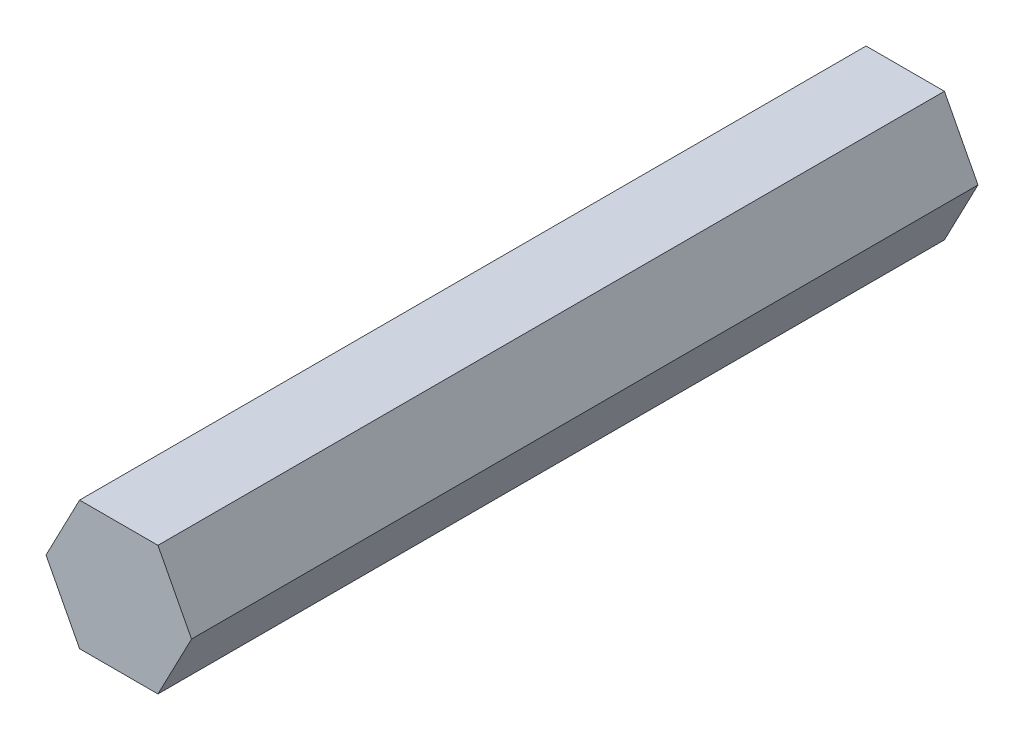
ISO-10303-21;
HEADER;
FILE_DESCRIPTION(('STEP AP214'),'2;1');
FILE_NAME('part.step','',(''),(''),'','','');
FILE_SCHEMA(('AUTOMOTIVE_DESIGN { 1 0 10303 214 1 1 1 1 }'));
ENDSEC;
DATA;
#1=APPLICATION_CONTEXT('core data for automotive mechanical design processes');
#2=APPLICATION_PROTOCOL_DEFINITION('international standard','automotive_design',2000,#1);
#3=PRODUCT_CONTEXT('',#1,'mechanical');
#4=PRODUCT('Part','Part','',(#3));
#5=PRODUCT_RELATED_PRODUCT_CATEGORY('part','',(#4));
#6=PRODUCT_DEFINITION_FORMATION('','',#4);
#7=PRODUCT_DEFINITION_CONTEXT('part definition',#1,'design');
#8=PRODUCT_DEFINITION('design','',#6,#7);
#9=PRODUCT_DEFINITION_SHAPE('','',#8);
#10=(LENGTH_UNIT() NAMED_UNIT(*) SI_UNIT(.MILLI.,.METRE.));
#11=(NAMED_UNIT(*) PLANE_ANGLE_UNIT() SI_UNIT($,.RADIAN.));
#12=(NAMED_UNIT(*) SI_UNIT($,.STERADIAN.) SOLID_ANGLE_UNIT());
#13=UNCERTAINTY_MEASURE_WITH_UNIT(LENGTH_MEASURE(1.E-05),#10,'distance_accuracy_value','');
#14=(GEOMETRIC_REPRESENTATION_CONTEXT(3) GLOBAL_UNCERTAINTY_ASSIGNED_CONTEXT((#13)) GLOBAL_UNIT_ASSIGNED_CONTEXT((#10,
#11,#12)) REPRESENTATION_CONTEXT('',''));
#15=CARTESIAN_POINT('',(0.,0.,0.));
#16=DIRECTION('',(0.,0.,1.));
#17=DIRECTION('',(1.,0.,0.));
#18=AXIS2_PLACEMENT_3D('',#15,#16,#17);
#19=CARTESIAN_POINT('',(-2.59978738302891,2.3,28.1));
#20=DIRECTION('',(0.886618456329491,-0.462501581506389,0.));
#21=DIRECTION('',(0.462501581506389,0.886618456329491,0.));
#22=AXIS2_PLACEMENT_3D('',#19,#20,#21);
#23=PLANE('',#22);
#24=DIRECTION('',(-0.462501581506389,-0.886618456329491,0.));
#25=VECTOR('',#24,1.);
#26=CARTESIAN_POINT('',(-2.59978738302891,2.3,0.));
#27=LINE('',#26,#25);
#28=CARTESIAN_POINT('',(-1.4,4.6,0.));
#29=VERTEX_POINT('',#28);
#30=CARTESIAN_POINT('',(-2.59978738302891,2.3,0.));
#31=VERTEX_POINT('',#30);
#32=EDGE_CURVE('E128',#29,#31,#27,.T.);
#33=ORIENTED_EDGE('',*,*,#32,.T.);
#34=DIRECTION('',(0.,0.,-1.));
#35=VECTOR('',#34,1.);
#36=CARTESIAN_POINT('',(-2.59978738302891,2.3,28.1));
#37=LINE('',#36,#35);
#38=CARTESIAN_POINT('',(-2.59978738302891,2.3,28.1));
#39=VERTEX_POINT('',#38);
#40=EDGE_CURVE('E11',#39,#31,#37,.T.);
#41=ORIENTED_EDGE('',*,*,#40,.F.);
#42=DIRECTION('',(-0.462501581506389,-0.886618456329491,0.));
#43=VECTOR('',#42,1.);
#44=CARTESIAN_POINT('',(-2.59978738302891,2.3,28.1));
#45=LINE('',#44,#43);
#46=CARTESIAN_POINT('',(-1.4,4.6,28.1));
#47=VERTEX_POINT('',#46);
#48=EDGE_CURVE('E145',#47,#39,#45,.T.);
#49=ORIENTED_EDGE('',*,*,#48,.F.);
#50=DIRECTION('',(0.,0.,-1.));
#51=VECTOR('',#50,1.);
#52=CARTESIAN_POINT('',(-1.4,4.6,28.1));
#53=LINE('',#52,#51);
#54=EDGE_CURVE('E124',#47,#29,#53,.T.);
#55=ORIENTED_EDGE('',*,*,#54,.T.);
#56=EDGE_LOOP('',(#33,#41,#49,#55));
#57=FACE_BOUND('',#56,.T.);
#58=ADVANCED_FACE('F39',(#57),#23,.F.);
#59=CARTESIAN_POINT('',(-1.4,0.,28.1));
#60=DIRECTION('',(0.886618456329491,0.462501581506389,0.));
#61=DIRECTION('',(-0.462501581506389,0.886618456329491,0.));
#62=AXIS2_PLACEMENT_3D('',#59,#60,#61);
#63=PLANE('',#62);
#64=DIRECTION('',(0.462501581506389,-0.886618456329491,0.));
#65=VECTOR('',#64,1.);
#66=CARTESIAN_POINT('',(-1.4,0.,0.));
#67=LINE('',#66,#65);
#68=CARTESIAN_POINT('',(-1.4,0.,0.));
#69=VERTEX_POINT('',#68);
#70=EDGE_CURVE('E132',#31,#69,#67,.T.);
#71=ORIENTED_EDGE('',*,*,#70,.T.);
#72=DIRECTION('',(0.,0.,-1.));
#73=VECTOR('',#72,1.);
#74=CARTESIAN_POINT('',(-1.4,0.,28.1));
#75=LINE('',#74,#73);
#76=CARTESIAN_POINT('',(-1.4,0.,28.1));
#77=VERTEX_POINT('',#76);
#78=EDGE_CURVE('E48',#77,#69,#75,.T.);
#79=ORIENTED_EDGE('',*,*,#78,.F.);
#80=DIRECTION('',(0.462501581506389,-0.886618456329491,0.));
#81=VECTOR('',#80,1.);
#82=CARTESIAN_POINT('',(-1.4,0.,28.1));
#83=LINE('',#82,#81);
#84=EDGE_CURVE('E93',#39,#77,#83,.T.);
#85=ORIENTED_EDGE('',*,*,#84,.F.);
#86=ORIENTED_EDGE('',*,*,#40,.T.);
#87=EDGE_LOOP('',(#71,#79,#85,#86));
#88=FACE_BOUND('',#87,.T.);
#89=ADVANCED_FACE('F173',(#88),#63,.F.);
#90=CARTESIAN_POINT('',(-1.4,0.,28.1));
#91=DIRECTION('',(0.,1.,0.));
#92=DIRECTION('',(-1.,0.,0.));
#93=AXIS2_PLACEMENT_3D('',#90,#91,#92);
#94=PLANE('',#93);
#95=DIRECTION('',(1.,0.,0.));
#96=VECTOR('',#95,1.);
#97=CARTESIAN_POINT('',(-1.4,0.,0.));
#98=LINE('',#97,#96);
#99=CARTESIAN_POINT('',(1.4,0.,0.));
#100=VERTEX_POINT('',#99);
#101=EDGE_CURVE('E136',#69,#100,#98,.T.);
#102=ORIENTED_EDGE('',*,*,#101,.T.);
#103=DIRECTION('',(0.,0.,-1.));
#104=VECTOR('',#103,1.);
#105=CARTESIAN_POINT('',(1.4,0.,28.1));
#106=LINE('',#105,#104);
#107=CARTESIAN_POINT('',(1.4,0.,28.1));
#108=VERTEX_POINT('',#107);
#109=EDGE_CURVE('E117',#108,#100,#106,.T.);
#110=ORIENTED_EDGE('',*,*,#109,.F.);
#111=DIRECTION('',(1.,0.,0.));
#112=VECTOR('',#111,1.);
#113=CARTESIAN_POINT('',(-1.4,0.,28.1));
#114=LINE('',#113,#112);
#115=EDGE_CURVE('E106',#77,#108,#114,.T.);
#116=ORIENTED_EDGE('',*,*,#115,.F.);
#117=ORIENTED_EDGE('',*,*,#78,.T.);
#118=EDGE_LOOP('',(#102,#110,#116,#117));
#119=FACE_BOUND('',#118,.T.);
#120=ADVANCED_FACE('F155',(#119),#94,.F.);
#121=CARTESIAN_POINT('',(1.4,0.,28.1));
#122=DIRECTION('',(-0.886618456329491,0.462501581506389,0.));
#123=DIRECTION('',(-0.462501581506389,-0.886618456329491,0.));
#124=AXIS2_PLACEMENT_3D('',#121,#122,#123);
#125=PLANE('',#124);
#126=DIRECTION('',(0.462501581506389,0.886618456329491,0.));
#127=VECTOR('',#126,1.);
#128=CARTESIAN_POINT('',(1.4,0.,0.));
#129=LINE('',#128,#127);
#130=CARTESIAN_POINT('',(2.59978738302891,2.3,0.));
#131=VERTEX_POINT('',#130);
#132=EDGE_CURVE('E115',#100,#131,#129,.T.);
#133=ORIENTED_EDGE('',*,*,#132,.T.);
#134=DIRECTION('',(0.,0.,-1.));
#135=VECTOR('',#134,1.);
#136=CARTESIAN_POINT('',(2.59978738302891,2.3,28.1));
#137=LINE('',#136,#135);
#138=CARTESIAN_POINT('',(2.59978738302891,2.3,28.1));
#139=VERTEX_POINT('',#138);
#140=EDGE_CURVE('E112',#139,#131,#137,.T.);
#141=ORIENTED_EDGE('',*,*,#140,.F.);
#142=DIRECTION('',(0.462501581506389,0.886618456329491,0.));
#143=VECTOR('',#142,1.);
#144=CARTESIAN_POINT('',(1.4,0.,28.1));
#145=LINE('',#144,#143);
#146=EDGE_CURVE('E100',#108,#139,#145,.T.);
#147=ORIENTED_EDGE('',*,*,#146,.F.);
#148=ORIENTED_EDGE('',*,*,#109,.T.);
#149=EDGE_LOOP('',(#133,#141,#147,#148));
#150=FACE_BOUND('',#149,.T.);
#151=ADVANCED_FACE('F113',(#150),#125,.F.);
#152=CARTESIAN_POINT('',(2.59978738302891,2.3,28.1));
#153=DIRECTION('',(-0.886618456329491,-0.462501581506389,0.));
#154=DIRECTION('',(0.462501581506389,-0.886618456329491,0.));
#155=AXIS2_PLACEMENT_3D('',#152,#153,#154);
#156=PLANE('',#155);
#157=DIRECTION('',(-0.462501581506389,0.886618456329491,0.));
#158=VECTOR('',#157,1.);
#159=CARTESIAN_POINT('',(2.59978738302891,2.3,0.));
#160=LINE('',#159,#158);
#161=CARTESIAN_POINT('',(1.4,4.6,0.));
#162=VERTEX_POINT('',#161);
#163=EDGE_CURVE('E79',#131,#162,#160,.T.);
#164=ORIENTED_EDGE('',*,*,#163,.T.);
#165=DIRECTION('',(0.,0.,-1.));
#166=VECTOR('',#165,1.);
#167=CARTESIAN_POINT('',(1.4,4.6,28.1));
#168=LINE('',#167,#166);
#169=CARTESIAN_POINT('',(1.4,4.6,28.1));
#170=VERTEX_POINT('',#169);
#171=EDGE_CURVE('E118',#170,#162,#168,.T.);
#172=ORIENTED_EDGE('',*,*,#171,.F.);
#173=DIRECTION('',(-0.462501581506389,0.886618456329491,0.));
#174=VECTOR('',#173,1.);
#175=CARTESIAN_POINT('',(2.59978738302891,2.3,28.1));
#176=LINE('',#175,#174);
#177=EDGE_CURVE('E104',#139,#170,#176,.T.);
#178=ORIENTED_EDGE('',*,*,#177,.F.);
#179=ORIENTED_EDGE('',*,*,#140,.T.);
#180=EDGE_LOOP('',(#164,#172,#178,#179));
#181=FACE_BOUND('',#180,.T.);
#182=ADVANCED_FACE('F120',(#181),#156,.F.);
#183=CARTESIAN_POINT('',(-1.4,4.6,28.1));
#184=DIRECTION('',(0.,-1.,0.));
#185=DIRECTION('',(0.,0.,-1.));
#186=AXIS2_PLACEMENT_3D('',#183,#184,#185);
#187=PLANE('',#186);
#188=DIRECTION('',(-1.,0.,0.));
#189=VECTOR('',#188,1.);
#190=CARTESIAN_POINT('',(-1.4,4.6,0.));
#191=LINE('',#190,#189);
#192=EDGE_CURVE('E85',#162,#29,#191,.T.);
#193=ORIENTED_EDGE('',*,*,#192,.T.);
#194=ORIENTED_EDGE('',*,*,#54,.F.);
#195=DIRECTION('',(-1.,0.,0.));
#196=VECTOR('',#195,1.);
#197=CARTESIAN_POINT('',(-1.4,4.6,28.1));
#198=LINE('',#197,#196);
#199=EDGE_CURVE('E56',#170,#47,#198,.T.);
#200=ORIENTED_EDGE('',*,*,#199,.F.);
#201=ORIENTED_EDGE('',*,*,#171,.T.);
#202=EDGE_LOOP('',(#193,#194,#200,#201));
#203=FACE_BOUND('',#202,.T.);
#204=ADVANCED_FACE('F162',(#203),#187,.F.);
#205=CARTESIAN_POINT('',(0.,0.,28.1));
#206=DIRECTION('',(0.,0.,-1.));
#207=DIRECTION('',(-1.,0.,0.));
#208=AXIS2_PLACEMENT_3D('',#205,#206,#207);
#209=PLANE('',#208);
#210=ORIENTED_EDGE('',*,*,#48,.T.);
#211=ORIENTED_EDGE('',*,*,#84,.T.);
#212=ORIENTED_EDGE('',*,*,#115,.T.);
#213=ORIENTED_EDGE('',*,*,#146,.T.);
#214=ORIENTED_EDGE('',*,*,#177,.T.);
#215=ORIENTED_EDGE('',*,*,#199,.T.);
#216=EDGE_LOOP('',(#210,#211,#212,#213,#214,#215));
#217=FACE_BOUND('',#216,.T.);
#218=ADVANCED_FACE('F102',(#217),#209,.F.);
#219=CARTESIAN_POINT('',(0.,0.,0.));
#220=DIRECTION('',(0.,0.,-1.));
#221=DIRECTION('',(-1.,0.,0.));
#222=AXIS2_PLACEMENT_3D('',#219,#220,#221);
#223=PLANE('',#222);
#224=CARTESIAN_POINT('',(0.,2.3,0.));
#225=DIRECTION('',(0.,0.,-1.));
#226=DIRECTION('',(-1.,0.,0.));
#227=AXIS2_PLACEMENT_3D('',#224,#225,#226);
#228=CIRCLE('',#227,1.5);
#229=CARTESIAN_POINT('',(-1.5,2.3,0.));
#230=VERTEX_POINT('',#229);
#231=EDGE_CURVE('E236',#230,#230,#228,.T.);
#232=ORIENTED_EDGE('',*,*,#231,.F.);
#233=EDGE_LOOP('',(#232));
#234=FACE_BOUND('',#233,.T.);
#235=ORIENTED_EDGE('',*,*,#32,.F.);
#236=ORIENTED_EDGE('',*,*,#192,.F.);
#237=ORIENTED_EDGE('',*,*,#163,.F.);
#238=ORIENTED_EDGE('',*,*,#132,.F.);
#239=ORIENTED_EDGE('',*,*,#101,.F.);
#240=ORIENTED_EDGE('',*,*,#70,.F.);
#241=EDGE_LOOP('',(#235,#236,#237,#238,#239,#240));
#242=FACE_BOUND('',#241,.T.);
#243=ADVANCED_FACE('F158',(#234,#242),#223,.T.);
#244=CARTESIAN_POINT('',(0.,2.3,2.));
#245=DIRECTION('',(0.,0.,-1.));
#246=DIRECTION('',(-1.,0.,0.));
#247=AXIS2_PLACEMENT_3D('',#244,#245,#246);
#248=CYLINDRICAL_SURFACE('',#247,1.5);
#249=CARTESIAN_POINT('',(0.,2.3,2.));
#250=DIRECTION('',(0.,0.,-1.));
#251=DIRECTION('',(-1.,0.,0.));
#252=AXIS2_PLACEMENT_3D('',#249,#250,#251);
#253=CIRCLE('',#252,1.5);
#254=CARTESIAN_POINT('',(-1.5,2.3,2.));
#255=VERTEX_POINT('',#254);
#256=EDGE_CURVE('E133',#255,#255,#253,.T.);
#257=ORIENTED_EDGE('',*,*,#256,.F.);
#258=EDGE_LOOP('',(#257));
#259=FACE_BOUND('',#258,.T.);
#260=ORIENTED_EDGE('',*,*,#231,.T.);
#261=EDGE_LOOP('',(#260));
#262=FACE_BOUND('',#261,.T.);
#263=ADVANCED_FACE('F210',(#259,#262),#248,.F.);
#264=CARTESIAN_POINT('',(0.,2.3,2.));
#265=DIRECTION('',(0.,0.,-1.));
#266=DIRECTION('',(-1.,0.,0.));
#267=AXIS2_PLACEMENT_3D('',#264,#265,#266);
#268=PLANE('',#267);
#269=ORIENTED_EDGE('',*,*,#256,.T.);
#270=EDGE_LOOP('',(#269));
#271=FACE_BOUND('',#270,.T.);
#272=ADVANCED_FACE('F219',(#271),#268,.T.);
#273=CLOSED_SHELL('',(#58,#89,#120,#151,#182,#204,#218,#243,#263,#272));
#274=MANIFOLD_SOLID_BREP('B2',#273);
#275=ADVANCED_BREP_SHAPE_REPRESENTATION('',(#18,#274),#14);
#276=SHAPE_DEFINITION_REPRESENTATION(#9,#275);
ENDSEC;
END-ISO-10303-21;
